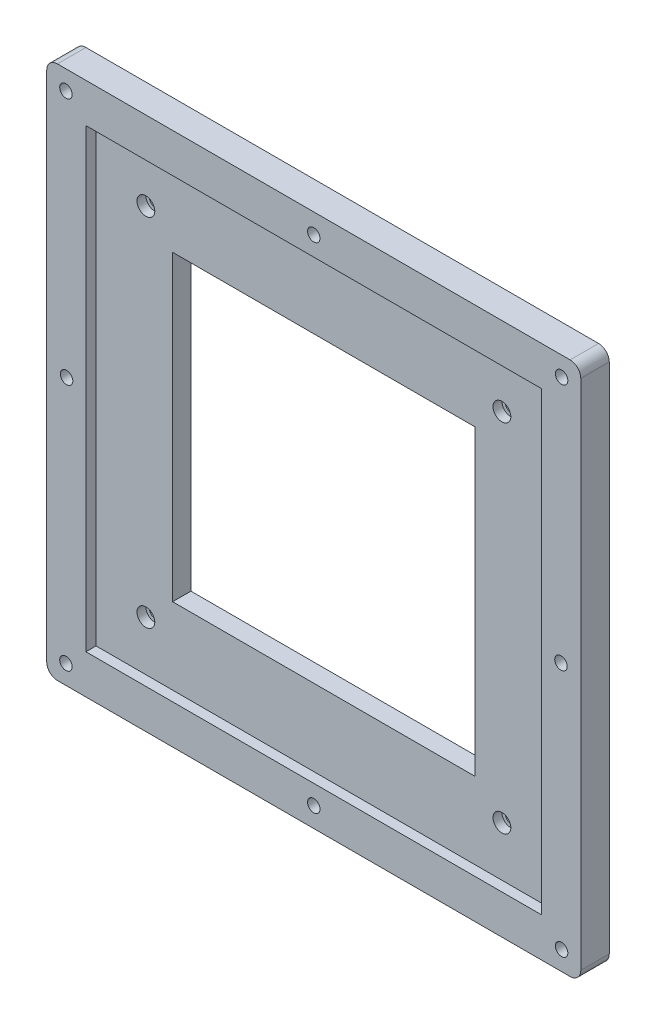
ISO-10303-21;
HEADER;
FILE_DESCRIPTION(('STEP AP214'),'2;1');
FILE_NAME('part.step','',(''),(''),'','','');
FILE_SCHEMA(('AUTOMOTIVE_DESIGN { 1 0 10303 214 1 1 1 1 }'));
ENDSEC;
DATA;
#1=APPLICATION_CONTEXT('core data for automotive mechanical design processes');
#2=APPLICATION_PROTOCOL_DEFINITION('international standard','automotive_design',2000,#1);
#3=PRODUCT_CONTEXT('',#1,'mechanical');
#4=PRODUCT('Part','Part','',(#3));
#5=PRODUCT_RELATED_PRODUCT_CATEGORY('part','',(#4));
#6=PRODUCT_DEFINITION_FORMATION('','',#4);
#7=PRODUCT_DEFINITION_CONTEXT('part definition',#1,'design');
#8=PRODUCT_DEFINITION('design','',#6,#7);
#9=PRODUCT_DEFINITION_SHAPE('','',#8);
#10=(LENGTH_UNIT() NAMED_UNIT(*) SI_UNIT(.MILLI.,.METRE.));
#11=(NAMED_UNIT(*) PLANE_ANGLE_UNIT() SI_UNIT($,.RADIAN.));
#12=(NAMED_UNIT(*) SI_UNIT($,.STERADIAN.) SOLID_ANGLE_UNIT());
#13=UNCERTAINTY_MEASURE_WITH_UNIT(LENGTH_MEASURE(1.E-05),#10,'distance_accuracy_value','');
#14=(GEOMETRIC_REPRESENTATION_CONTEXT(3) GLOBAL_UNCERTAINTY_ASSIGNED_CONTEXT((#13)) GLOBAL_UNIT_ASSIGNED_CONTEXT((#10,
#11,#12)) REPRESENTATION_CONTEXT('',''));
#15=CARTESIAN_POINT('',(0.,0.,0.));
#16=DIRECTION('',(0.,0.,1.));
#17=DIRECTION('',(1.,0.,0.));
#18=AXIS2_PLACEMENT_3D('',#15,#16,#17);
#19=CARTESIAN_POINT('',(42.5,42.5,8.));
#20=DIRECTION('',(-1.,0.,0.));
#21=DIRECTION('',(0.,-1.,0.));
#22=AXIS2_PLACEMENT_3D('',#19,#20,#21);
#23=PLANE('',#22);
#24=DIRECTION('',(0.,0.,-1.));
#25=VECTOR('',#24,1.);
#26=CARTESIAN_POINT('',(42.5,-42.5,8.));
#27=LINE('',#26,#25);
#28=CARTESIAN_POINT('',(42.5,-42.5,5.15));
#29=VERTEX_POINT('',#28);
#30=CARTESIAN_POINT('',(42.5,-42.5,0.));
#31=VERTEX_POINT('',#30);
#32=EDGE_CURVE('E233',#29,#31,#27,.T.);
#33=ORIENTED_EDGE('',*,*,#32,.F.);
#34=DIRECTION('',(0.,1.,0.));
#35=VECTOR('',#34,1.);
#36=CARTESIAN_POINT('',(42.5,42.5,5.15));
#37=LINE('',#36,#35);
#38=CARTESIAN_POINT('',(42.5,42.5,5.15));
#39=VERTEX_POINT('',#38);
#40=EDGE_CURVE('E206',#29,#39,#37,.T.);
#41=ORIENTED_EDGE('',*,*,#40,.T.);
#42=DIRECTION('',(0.,0.,-1.));
#43=VECTOR('',#42,1.);
#44=CARTESIAN_POINT('',(42.5,42.5,8.));
#45=LINE('',#44,#43);
#46=CARTESIAN_POINT('',(42.5,42.5,0.));
#47=VERTEX_POINT('',#46);
#48=EDGE_CURVE('E239',#39,#47,#45,.T.);
#49=ORIENTED_EDGE('',*,*,#48,.T.);
#50=DIRECTION('',(0.,1.,0.));
#51=VECTOR('',#50,1.);
#52=CARTESIAN_POINT('',(42.5,42.5,0.));
#53=LINE('',#52,#51);
#54=EDGE_CURVE('E221',#31,#47,#53,.T.);
#55=ORIENTED_EDGE('',*,*,#54,.F.);
#56=EDGE_LOOP('',(#33,#41,#49,#55));
#57=FACE_BOUND('',#56,.T.);
#58=ADVANCED_FACE('F35',(#57),#23,.T.);
#59=CARTESIAN_POINT('',(-42.5,42.5,8.));
#60=DIRECTION('',(0.,-1.,0.));
#61=DIRECTION('',(0.,0.,-1.));
#62=AXIS2_PLACEMENT_3D('',#59,#60,#61);
#63=PLANE('',#62);
#64=ORIENTED_EDGE('',*,*,#48,.F.);
#65=DIRECTION('',(-1.,0.,0.));
#66=VECTOR('',#65,1.);
#67=CARTESIAN_POINT('',(-42.5,42.5,5.15));
#68=LINE('',#67,#66);
#69=CARTESIAN_POINT('',(-42.5,42.5,5.15));
#70=VERTEX_POINT('',#69);
#71=EDGE_CURVE('E203',#39,#70,#68,.T.);
#72=ORIENTED_EDGE('',*,*,#71,.T.);
#73=DIRECTION('',(0.,0.,-1.));
#74=VECTOR('',#73,1.);
#75=CARTESIAN_POINT('',(-42.5,42.5,8.));
#76=LINE('',#75,#74);
#77=CARTESIAN_POINT('',(-42.5,42.5,0.));
#78=VERTEX_POINT('',#77);
#79=EDGE_CURVE('E237',#70,#78,#76,.T.);
#80=ORIENTED_EDGE('',*,*,#79,.T.);
#81=DIRECTION('',(-1.,0.,0.));
#82=VECTOR('',#81,1.);
#83=CARTESIAN_POINT('',(-42.5,42.5,0.));
#84=LINE('',#83,#82);
#85=EDGE_CURVE('E224',#47,#78,#84,.T.);
#86=ORIENTED_EDGE('',*,*,#85,.F.);
#87=EDGE_LOOP('',(#64,#72,#80,#86));
#88=FACE_BOUND('',#87,.T.);
#89=ADVANCED_FACE('F382',(#88),#63,.T.);
#90=CARTESIAN_POINT('',(-42.5,42.5,8.));
#91=DIRECTION('',(1.,0.,0.));
#92=DIRECTION('',(0.,1.,0.));
#93=AXIS2_PLACEMENT_3D('',#90,#91,#92);
#94=PLANE('',#93);
#95=ORIENTED_EDGE('',*,*,#79,.F.);
#96=DIRECTION('',(0.,-1.,0.));
#97=VECTOR('',#96,1.);
#98=CARTESIAN_POINT('',(-42.5,42.5,5.15));
#99=LINE('',#98,#97);
#100=CARTESIAN_POINT('',(-42.5,-42.5,5.15));
#101=VERTEX_POINT('',#100);
#102=EDGE_CURVE('E200',#70,#101,#99,.T.);
#103=ORIENTED_EDGE('',*,*,#102,.T.);
#104=DIRECTION('',(0.,0.,-1.));
#105=VECTOR('',#104,1.);
#106=CARTESIAN_POINT('',(-42.5,-42.5,8.));
#107=LINE('',#106,#105);
#108=CARTESIAN_POINT('',(-42.5,-42.5,0.));
#109=VERTEX_POINT('',#108);
#110=EDGE_CURVE('E235',#101,#109,#107,.T.);
#111=ORIENTED_EDGE('',*,*,#110,.T.);
#112=DIRECTION('',(0.,-1.,0.));
#113=VECTOR('',#112,1.);
#114=CARTESIAN_POINT('',(-42.5,42.5,0.));
#115=LINE('',#114,#113);
#116=EDGE_CURVE('E227',#78,#109,#115,.T.);
#117=ORIENTED_EDGE('',*,*,#116,.F.);
#118=EDGE_LOOP('',(#95,#103,#111,#117));
#119=FACE_BOUND('',#118,.T.);
#120=ADVANCED_FACE('F388',(#119),#94,.T.);
#121=CARTESIAN_POINT('',(-42.5,-42.5,8.));
#122=DIRECTION('',(0.,1.,0.));
#123=DIRECTION('',(-1.,0.,0.));
#124=AXIS2_PLACEMENT_3D('',#121,#122,#123);
#125=PLANE('',#124);
#126=ORIENTED_EDGE('',*,*,#110,.F.);
#127=DIRECTION('',(1.,0.,0.));
#128=VECTOR('',#127,1.);
#129=CARTESIAN_POINT('',(-42.5,-42.5,5.15));
#130=LINE('',#129,#128);
#131=EDGE_CURVE('E194',#101,#29,#130,.T.);
#132=ORIENTED_EDGE('',*,*,#131,.T.);
#133=ORIENTED_EDGE('',*,*,#32,.T.);
#134=DIRECTION('',(1.,0.,0.));
#135=VECTOR('',#134,1.);
#136=CARTESIAN_POINT('',(-42.5,-42.5,0.));
#137=LINE('',#136,#135);
#138=EDGE_CURVE('E230',#109,#31,#137,.T.);
#139=ORIENTED_EDGE('',*,*,#138,.F.);
#140=EDGE_LOOP('',(#126,#132,#133,#139));
#141=FACE_BOUND('',#140,.T.);
#142=ADVANCED_FACE('F481',(#141),#125,.T.);
#143=CARTESIAN_POINT('',(-50.,50.,8.));
#144=DIRECTION('',(0.,0.,-1.));
#145=DIRECTION('',(-1.,0.,0.));
#146=AXIS2_PLACEMENT_3D('',#143,#144,#145);
#147=CYLINDRICAL_SURFACE('',#146,1.5);
#148=CARTESIAN_POINT('',(-50.,50.,2.65));
#149=DIRECTION('',(0.,0.,-1.));
#150=DIRECTION('',(-1.,0.,0.));
#151=AXIS2_PLACEMENT_3D('',#148,#149,#150);
#152=CIRCLE('',#151,1.5);
#153=CARTESIAN_POINT('',(-51.5,50.,2.65));
#154=VERTEX_POINT('',#153);
#155=EDGE_CURVE('E188',#154,#154,#152,.T.);
#156=ORIENTED_EDGE('',*,*,#155,.F.);
#157=EDGE_LOOP('',(#156));
#158=FACE_BOUND('',#157,.T.);
#159=CARTESIAN_POINT('',(-50.,50.,0.));
#160=DIRECTION('',(0.,0.,1.));
#161=DIRECTION('',(1.,0.,0.));
#162=AXIS2_PLACEMENT_3D('',#159,#160,#161);
#163=CIRCLE('',#162,1.5);
#164=CARTESIAN_POINT('',(-48.5,50.,0.));
#165=VERTEX_POINT('',#164);
#166=EDGE_CURVE('E218',#165,#165,#163,.T.);
#167=ORIENTED_EDGE('',*,*,#166,.F.);
#168=EDGE_LOOP('',(#167));
#169=FACE_BOUND('',#168,.T.);
#170=ADVANCED_FACE('F477',(#158,#169),#147,.F.);
#171=CARTESIAN_POINT('',(50.,50.0000000000042,8.));
#172=DIRECTION('',(0.,0.,-1.));
#173=DIRECTION('',(-1.,0.,0.));
#174=AXIS2_PLACEMENT_3D('',#171,#172,#173);
#175=CYLINDRICAL_SURFACE('',#174,1.5);
#176=CARTESIAN_POINT('',(50.,50.0000000000042,2.65));
#177=DIRECTION('',(0.,0.,-1.));
#178=DIRECTION('',(-1.,0.,0.));
#179=AXIS2_PLACEMENT_3D('',#176,#177,#178);
#180=CIRCLE('',#179,1.5);
#181=CARTESIAN_POINT('',(48.5,50.0000000000042,2.65));
#182=VERTEX_POINT('',#181);
#183=EDGE_CURVE('E300',#182,#182,#180,.T.);
#184=ORIENTED_EDGE('',*,*,#183,.F.);
#185=EDGE_LOOP('',(#184));
#186=FACE_BOUND('',#185,.T.);
#187=CARTESIAN_POINT('',(50.,50.0000000000042,0.));
#188=DIRECTION('',(0.,0.,1.));
#189=DIRECTION('',(1.,0.,0.));
#190=AXIS2_PLACEMENT_3D('',#187,#188,#189);
#191=CIRCLE('',#190,1.5);
#192=CARTESIAN_POINT('',(51.5,50.0000000000042,0.));
#193=VERTEX_POINT('',#192);
#194=EDGE_CURVE('E215',#193,#193,#191,.T.);
#195=ORIENTED_EDGE('',*,*,#194,.F.);
#196=EDGE_LOOP('',(#195));
#197=FACE_BOUND('',#196,.T.);
#198=ADVANCED_FACE('F468',(#186,#197),#175,.F.);
#199=CARTESIAN_POINT('',(50.0000000000042,-49.9999999999958,8.));
#200=DIRECTION('',(0.,0.,-1.));
#201=DIRECTION('',(-1.,0.,0.));
#202=AXIS2_PLACEMENT_3D('',#199,#200,#201);
#203=CYLINDRICAL_SURFACE('',#202,1.5);
#204=CARTESIAN_POINT('',(50.0000000000042,-49.9999999999958,2.65));
#205=DIRECTION('',(0.,0.,-1.));
#206=DIRECTION('',(-1.,0.,0.));
#207=AXIS2_PLACEMENT_3D('',#204,#205,#206);
#208=CIRCLE('',#207,1.5);
#209=CARTESIAN_POINT('',(48.5000000000042,-49.9999999999958,2.65));
#210=VERTEX_POINT('',#209);
#211=EDGE_CURVE('E296',#210,#210,#208,.T.);
#212=ORIENTED_EDGE('',*,*,#211,.F.);
#213=EDGE_LOOP('',(#212));
#214=FACE_BOUND('',#213,.T.);
#215=CARTESIAN_POINT('',(50.0000000000042,-49.9999999999958,0.));
#216=DIRECTION('',(0.,0.,1.));
#217=DIRECTION('',(1.,0.,0.));
#218=AXIS2_PLACEMENT_3D('',#215,#216,#217);
#219=CIRCLE('',#218,1.5);
#220=CARTESIAN_POINT('',(51.5000000000042,-49.9999999999958,0.));
#221=VERTEX_POINT('',#220);
#222=EDGE_CURVE('E212',#221,#221,#219,.T.);
#223=ORIENTED_EDGE('',*,*,#222,.F.);
#224=EDGE_LOOP('',(#223));
#225=FACE_BOUND('',#224,.T.);
#226=ADVANCED_FACE('F462',(#214,#225),#203,.F.);
#227=CARTESIAN_POINT('',(-49.9999999999958,-50.,8.));
#228=DIRECTION('',(0.,0.,-1.));
#229=DIRECTION('',(-1.,0.,0.));
#230=AXIS2_PLACEMENT_3D('',#227,#228,#229);
#231=CYLINDRICAL_SURFACE('',#230,1.5);
#232=CARTESIAN_POINT('',(-49.9999999999958,-50.,2.65));
#233=DIRECTION('',(0.,0.,-1.));
#234=DIRECTION('',(-1.,0.,0.));
#235=AXIS2_PLACEMENT_3D('',#232,#233,#234);
#236=CIRCLE('',#235,1.5);
#237=CARTESIAN_POINT('',(-51.4999999999958,-50.,2.65));
#238=VERTEX_POINT('',#237);
#239=EDGE_CURVE('E293',#238,#238,#236,.T.);
#240=ORIENTED_EDGE('',*,*,#239,.F.);
#241=EDGE_LOOP('',(#240));
#242=FACE_BOUND('',#241,.T.);
#243=CARTESIAN_POINT('',(-49.9999999999958,-50.,0.));
#244=DIRECTION('',(0.,0.,1.));
#245=DIRECTION('',(1.,0.,0.));
#246=AXIS2_PLACEMENT_3D('',#243,#244,#245);
#247=CIRCLE('',#246,1.5);
#248=CARTESIAN_POINT('',(-48.4999999999958,-50.,0.));
#249=VERTEX_POINT('',#248);
#250=EDGE_CURVE('E209',#249,#249,#247,.T.);
#251=ORIENTED_EDGE('',*,*,#250,.F.);
#252=EDGE_LOOP('',(#251));
#253=FACE_BOUND('',#252,.T.);
#254=ADVANCED_FACE('F398',(#242,#253),#231,.F.);
#255=CARTESIAN_POINT('',(0.,0.,8.));
#256=DIRECTION('',(0.,0.,1.));
#257=DIRECTION('',(1.,0.,0.));
#258=AXIS2_PLACEMENT_3D('',#255,#256,#257);
#259=PLANE('',#258);
#260=CARTESIAN_POINT('',(7.87642173307148E-12,-69.4313225757113,8.));
#261=DIRECTION('',(0.,0.,1.));
#262=DIRECTION('',(1.,0.,0.));
#263=AXIS2_PLACEMENT_3D('',#260,#261,#262);
#264=CIRCLE('',#263,1.750000000008);
#265=CARTESIAN_POINT('',(1.75000000001587,-69.4313225757113,8.));
#266=VERTEX_POINT('',#265);
#267=EDGE_CURVE('E753',#266,#266,#264,.T.);
#268=ORIENTED_EDGE('',*,*,#267,.F.);
#269=EDGE_LOOP('',(#268));
#270=FACE_BOUND('',#269,.T.);
#271=CARTESIAN_POINT('',(69.6101910608104,69.6101910608104,8.));
#272=DIRECTION('',(0.,0.,1.));
#273=DIRECTION('',(1.,0.,0.));
#274=AXIS2_PLACEMENT_3D('',#271,#272,#273);
#275=CIRCLE('',#274,1.75000000000246);
#276=CARTESIAN_POINT('',(71.3601910608128,69.6101910608104,8.));
#277=VERTEX_POINT('',#276);
#278=EDGE_CURVE('E754',#277,#277,#275,.T.);
#279=ORIENTED_EDGE('',*,*,#278,.F.);
#280=EDGE_LOOP('',(#279));
#281=FACE_BOUND('',#280,.T.);
#282=CARTESIAN_POINT('',(69.4313225757152,3.93821086653574E-12,8.));
#283=DIRECTION('',(0.,0.,1.));
#284=DIRECTION('',(1.,0.,0.));
#285=AXIS2_PLACEMENT_3D('',#282,#283,#284);
#286=CIRCLE('',#285,1.75000000000285);
#287=CARTESIAN_POINT('',(71.1813225757181,3.93821086653574E-12,8.));
#288=VERTEX_POINT('',#287);
#289=EDGE_CURVE('E758',#288,#288,#286,.T.);
#290=ORIENTED_EDGE('',*,*,#289,.F.);
#291=EDGE_LOOP('',(#290));
#292=FACE_BOUND('',#291,.T.);
#293=CARTESIAN_POINT('',(-69.6101910608068,69.6101910608061,8.));
#294=DIRECTION('',(0.,0.,1.));
#295=DIRECTION('',(1.,0.,0.));
#296=AXIS2_PLACEMENT_3D('',#293,#294,#295);
#297=CIRCLE('',#296,1.75);
#298=CARTESIAN_POINT('',(-67.8601910608068,69.6101910608061,8.));
#299=VERTEX_POINT('',#298);
#300=EDGE_CURVE('E765',#299,#299,#297,.T.);
#301=ORIENTED_EDGE('',*,*,#300,.F.);
#302=EDGE_LOOP('',(#301));
#303=FACE_BOUND('',#302,.T.);
#304=CARTESIAN_POINT('',(-69.6101910608025,-69.6101910608104,8.));
#305=DIRECTION('',(0.,0.,1.));
#306=DIRECTION('',(1.,0.,0.));
#307=AXIS2_PLACEMENT_3D('',#304,#305,#306);
#308=CIRCLE('',#307,1.75000000000537);
#309=CARTESIAN_POINT('',(-67.8601910607971,-69.6101910608104,8.));
#310=VERTEX_POINT('',#309);
#311=EDGE_CURVE('E777',#310,#310,#308,.T.);
#312=ORIENTED_EDGE('',*,*,#311,.F.);
#313=EDGE_LOOP('',(#312));
#314=FACE_BOUND('',#313,.T.);
#315=CARTESIAN_POINT('',(-69.4313225757073,-3.94671375123103E-12,8.));
#316=DIRECTION('',(0.,0.,1.));
#317=DIRECTION('',(1.,0.,0.));
#318=AXIS2_PLACEMENT_3D('',#315,#316,#317);
#319=CIRCLE('',#318,1.75000000000562);
#320=CARTESIAN_POINT('',(-67.6813225757017,-3.94671375123103E-12,8.));
#321=VERTEX_POINT('',#320);
#322=EDGE_CURVE('E761',#321,#321,#319,.T.);
#323=ORIENTED_EDGE('',*,*,#322,.F.);
#324=EDGE_LOOP('',(#323));
#325=FACE_BOUND('',#324,.T.);
#326=CARTESIAN_POINT('',(69.6101910608143,-69.6101910608064,8.));
#327=DIRECTION('',(0.,0.,1.));
#328=DIRECTION('',(1.,0.,0.));
#329=AXIS2_PLACEMENT_3D('',#326,#327,#328);
#330=CIRCLE('',#329,1.75000000000769);
#331=CARTESIAN_POINT('',(71.360191060822,-69.6101910608064,8.));
#332=VERTEX_POINT('',#331);
#333=EDGE_CURVE('E755',#332,#332,#330,.T.);
#334=ORIENTED_EDGE('',*,*,#333,.F.);
#335=EDGE_LOOP('',(#334));
#336=FACE_BOUND('',#335,.T.);
#337=CARTESIAN_POINT('',(0.,69.4313225757113,8.));
#338=DIRECTION('',(0.,0.,1.));
#339=DIRECTION('',(1.,0.,0.));
#340=AXIS2_PLACEMENT_3D('',#337,#338,#339);
#341=CIRCLE('',#340,1.75);
#342=CARTESIAN_POINT('',(1.75,69.4313225757113,8.));
#343=VERTEX_POINT('',#342);
#344=EDGE_CURVE('E309',#343,#343,#341,.T.);
#345=ORIENTED_EDGE('',*,*,#344,.F.);
#346=EDGE_LOOP('',(#345));
#347=FACE_BOUND('',#346,.T.);
#348=DIRECTION('',(0.,1.,0.));
#349=VECTOR('',#348,1.);
#350=CARTESIAN_POINT('',(64.,64.,8.));
#351=LINE('',#350,#349);
#352=CARTESIAN_POINT('',(64.,-64.,8.));
#353=VERTEX_POINT('',#352);
#354=CARTESIAN_POINT('',(64.,64.,8.));
#355=VERTEX_POINT('',#354);
#356=EDGE_CURVE('E158',#353,#355,#351,.T.);
#357=ORIENTED_EDGE('',*,*,#356,.F.);
#358=DIRECTION('',(1.,0.,0.));
#359=VECTOR('',#358,1.);
#360=CARTESIAN_POINT('',(-64.,-64.,8.));
#361=LINE('',#360,#359);
#362=CARTESIAN_POINT('',(-64.,-64.,8.));
#363=VERTEX_POINT('',#362);
#364=EDGE_CURVE('E175',#363,#353,#361,.T.);
#365=ORIENTED_EDGE('',*,*,#364,.F.);
#366=DIRECTION('',(0.,-1.,0.));
#367=VECTOR('',#366,1.);
#368=CARTESIAN_POINT('',(-64.,64.,8.));
#369=LINE('',#368,#367);
#370=CARTESIAN_POINT('',(-64.,64.,8.));
#371=VERTEX_POINT('',#370);
#372=EDGE_CURVE('E178',#371,#363,#369,.T.);
#373=ORIENTED_EDGE('',*,*,#372,.F.);
#374=DIRECTION('',(-1.,0.,0.));
#375=VECTOR('',#374,1.);
#376=CARTESIAN_POINT('',(-64.,64.,8.));
#377=LINE('',#376,#375);
#378=EDGE_CURVE('E187',#355,#371,#377,.T.);
#379=ORIENTED_EDGE('',*,*,#378,.F.);
#380=EDGE_LOOP('',(#357,#365,#373,#379));
#381=FACE_BOUND('',#380,.T.);
#382=DIRECTION('',(0.,-1.,0.));
#383=VECTOR('',#382,1.);
#384=CARTESIAN_POINT('',(-75.,74.9999999999998,8.));
#385=LINE('',#384,#383);
#386=CARTESIAN_POINT('',(-75.,71.9999999999998,8.));
#387=VERTEX_POINT('',#386);
#388=CARTESIAN_POINT('',(-75.,-71.9999999999997,8.));
#389=VERTEX_POINT('',#388);
#390=EDGE_CURVE('E247',#387,#389,#385,.T.);
#391=ORIENTED_EDGE('',*,*,#390,.T.);
#392=CARTESIAN_POINT('',(-72.,-71.9999999999997,8.));
#393=DIRECTION('',(0.,0.,1.));
#394=DIRECTION('',(1.,0.,0.));
#395=AXIS2_PLACEMENT_3D('',#392,#393,#394);
#396=CIRCLE('',#395,3.);
#397=CARTESIAN_POINT('',(-72.,-74.9999999999997,8.));
#398=VERTEX_POINT('',#397);
#399=EDGE_CURVE('E285',#389,#398,#396,.T.);
#400=ORIENTED_EDGE('',*,*,#399,.T.);
#401=DIRECTION('',(1.,0.,0.));
#402=VECTOR('',#401,1.);
#403=CARTESIAN_POINT('',(-75.,-74.9999999999997,8.));
#404=LINE('',#403,#402);
#405=CARTESIAN_POINT('',(72.,-74.9999999999997,8.));
#406=VERTEX_POINT('',#405);
#407=EDGE_CURVE('E250',#398,#406,#404,.T.);
#408=ORIENTED_EDGE('',*,*,#407,.T.);
#409=CARTESIAN_POINT('',(72.,-71.9999999999997,8.));
#410=DIRECTION('',(0.,0.,1.));
#411=DIRECTION('',(1.,0.,0.));
#412=AXIS2_PLACEMENT_3D('',#409,#410,#411);
#413=CIRCLE('',#412,3.);
#414=CARTESIAN_POINT('',(75.,-71.9999999999997,8.));
#415=VERTEX_POINT('',#414);
#416=EDGE_CURVE('E283',#406,#415,#413,.T.);
#417=ORIENTED_EDGE('',*,*,#416,.T.);
#418=DIRECTION('',(0.,1.,0.));
#419=VECTOR('',#418,1.);
#420=CARTESIAN_POINT('',(75.,74.9999999999998,8.));
#421=LINE('',#420,#419);
#422=CARTESIAN_POINT('',(75.,71.9999999999998,8.));
#423=VERTEX_POINT('',#422);
#424=EDGE_CURVE('E242',#415,#423,#421,.T.);
#425=ORIENTED_EDGE('',*,*,#424,.T.);
#426=CARTESIAN_POINT('',(72.,71.9999999999998,8.));
#427=DIRECTION('',(0.,0.,1.));
#428=DIRECTION('',(1.,0.,0.));
#429=AXIS2_PLACEMENT_3D('',#426,#427,#428);
#430=CIRCLE('',#429,3.);
#431=CARTESIAN_POINT('',(72.,74.9999999999998,8.));
#432=VERTEX_POINT('',#431);
#433=EDGE_CURVE('E58',#423,#432,#430,.T.);
#434=ORIENTED_EDGE('',*,*,#433,.T.);
#435=DIRECTION('',(-1.,0.,0.));
#436=VECTOR('',#435,1.);
#437=CARTESIAN_POINT('',(-75.,74.9999999999998,8.));
#438=LINE('',#437,#436);
#439=CARTESIAN_POINT('',(-72.,74.9999999999998,8.));
#440=VERTEX_POINT('',#439);
#441=EDGE_CURVE('E244',#432,#440,#438,.T.);
#442=ORIENTED_EDGE('',*,*,#441,.T.);
#443=CARTESIAN_POINT('',(-72.,71.9999999999998,8.));
#444=DIRECTION('',(0.,0.,1.));
#445=DIRECTION('',(1.,0.,0.));
#446=AXIS2_PLACEMENT_3D('',#443,#444,#445);
#447=CIRCLE('',#446,3.);
#448=EDGE_CURVE('E280',#440,#387,#447,.T.);
#449=ORIENTED_EDGE('',*,*,#448,.T.);
#450=EDGE_LOOP('',(#391,#400,#408,#417,#425,#434,#442,#449));
#451=FACE_BOUND('',#450,.T.);
#452=ADVANCED_FACE('F394',(#270,#281,#292,#303,#314,#325,#336,#347,#381,#451),#259,.T.);
#453=CARTESIAN_POINT('',(0.,0.,0.));
#454=DIRECTION('',(0.,0.,1.));
#455=DIRECTION('',(1.,0.,0.));
#456=AXIS2_PLACEMENT_3D('',#453,#454,#455);
#457=PLANE('',#456);
#458=CARTESIAN_POINT('',(7.87642173307148E-12,-69.4313225757113,0.));
#459=DIRECTION('',(0.,0.,1.));
#460=DIRECTION('',(1.,0.,0.));
#461=AXIS2_PLACEMENT_3D('',#458,#459,#460);
#462=CIRCLE('',#461,1.750000000008);
#463=CARTESIAN_POINT('',(1.75000000001587,-69.4313225757113,0.));
#464=VERTEX_POINT('',#463);
#465=EDGE_CURVE('E39',#464,#464,#462,.T.);
#466=ORIENTED_EDGE('',*,*,#465,.T.);
#467=EDGE_LOOP('',(#466));
#468=FACE_BOUND('',#467,.T.);
#469=CARTESIAN_POINT('',(69.6101910608104,69.6101910608104,0.));
#470=DIRECTION('',(0.,0.,1.));
#471=DIRECTION('',(1.,0.,0.));
#472=AXIS2_PLACEMENT_3D('',#469,#470,#471);
#473=CIRCLE('',#472,1.75000000000246);
#474=CARTESIAN_POINT('',(71.3601910608128,69.6101910608104,0.));
#475=VERTEX_POINT('',#474);
#476=EDGE_CURVE('E323',#475,#475,#473,.T.);
#477=ORIENTED_EDGE('',*,*,#476,.T.);
#478=EDGE_LOOP('',(#477));
#479=FACE_BOUND('',#478,.T.);
#480=CARTESIAN_POINT('',(69.4313225757152,3.93821086653574E-12,0.));
#481=DIRECTION('',(0.,0.,1.));
#482=DIRECTION('',(1.,0.,0.));
#483=AXIS2_PLACEMENT_3D('',#480,#481,#482);
#484=CIRCLE('',#483,1.75000000000285);
#485=CARTESIAN_POINT('',(71.1813225757181,3.93821086653574E-12,0.));
#486=VERTEX_POINT('',#485);
#487=EDGE_CURVE('E321',#486,#486,#484,.T.);
#488=ORIENTED_EDGE('',*,*,#487,.T.);
#489=EDGE_LOOP('',(#488));
#490=FACE_BOUND('',#489,.T.);
#491=CARTESIAN_POINT('',(-69.6101910608068,69.6101910608061,0.));
#492=DIRECTION('',(0.,0.,1.));
#493=DIRECTION('',(1.,0.,0.));
#494=AXIS2_PLACEMENT_3D('',#491,#492,#493);
#495=CIRCLE('',#494,1.75);
#496=CARTESIAN_POINT('',(-67.8601910608068,69.6101910608061,0.));
#497=VERTEX_POINT('',#496);
#498=EDGE_CURVE('E318',#497,#497,#495,.T.);
#499=ORIENTED_EDGE('',*,*,#498,.T.);
#500=EDGE_LOOP('',(#499));
#501=FACE_BOUND('',#500,.T.);
#502=CARTESIAN_POINT('',(-69.6101910608025,-69.6101910608104,0.));
#503=DIRECTION('',(0.,0.,1.));
#504=DIRECTION('',(1.,0.,0.));
#505=AXIS2_PLACEMENT_3D('',#502,#503,#504);
#506=CIRCLE('',#505,1.75000000000537);
#507=CARTESIAN_POINT('',(-67.8601910607971,-69.6101910608104,0.));
#508=VERTEX_POINT('',#507);
#509=EDGE_CURVE('E315',#508,#508,#506,.T.);
#510=ORIENTED_EDGE('',*,*,#509,.T.);
#511=EDGE_LOOP('',(#510));
#512=FACE_BOUND('',#511,.T.);
#513=CARTESIAN_POINT('',(-69.4313225757073,-3.94671375123103E-12,0.));
#514=DIRECTION('',(0.,0.,1.));
#515=DIRECTION('',(1.,0.,0.));
#516=AXIS2_PLACEMENT_3D('',#513,#514,#515);
#517=CIRCLE('',#516,1.75000000000562);
#518=CARTESIAN_POINT('',(-67.6813225757017,-3.94671375123103E-12,0.));
#519=VERTEX_POINT('',#518);
#520=EDGE_CURVE('E312',#519,#519,#517,.T.);
#521=ORIENTED_EDGE('',*,*,#520,.T.);
#522=EDGE_LOOP('',(#521));
#523=FACE_BOUND('',#522,.T.);
#524=CARTESIAN_POINT('',(69.6101910608143,-69.6101910608064,0.));
#525=DIRECTION('',(0.,0.,1.));
#526=DIRECTION('',(1.,0.,0.));
#527=AXIS2_PLACEMENT_3D('',#524,#525,#526);
#528=CIRCLE('',#527,1.75000000000769);
#529=CARTESIAN_POINT('',(71.360191060822,-69.6101910608064,0.));
#530=VERTEX_POINT('',#529);
#531=EDGE_CURVE('E308',#530,#530,#528,.T.);
#532=ORIENTED_EDGE('',*,*,#531,.T.);
#533=EDGE_LOOP('',(#532));
#534=FACE_BOUND('',#533,.T.);
#535=CARTESIAN_POINT('',(0.,69.4313225757113,0.));
#536=DIRECTION('',(0.,0.,1.));
#537=DIRECTION('',(1.,0.,0.));
#538=AXIS2_PLACEMENT_3D('',#535,#536,#537);
#539=CIRCLE('',#538,1.75);
#540=CARTESIAN_POINT('',(1.75,69.4313225757113,0.));
#541=VERTEX_POINT('',#540);
#542=EDGE_CURVE('E305',#541,#541,#539,.T.);
#543=ORIENTED_EDGE('',*,*,#542,.T.);
#544=EDGE_LOOP('',(#543));
#545=FACE_BOUND('',#544,.T.);
#546=DIRECTION('',(1.,0.,0.));
#547=VECTOR('',#546,1.);
#548=CARTESIAN_POINT('',(-75.,-74.9999999999997,0.));
#549=LINE('',#548,#547);
#550=CARTESIAN_POINT('',(-72.,-74.9999999999997,0.));
#551=VERTEX_POINT('',#550);
#552=CARTESIAN_POINT('',(72.,-74.9999999999997,0.));
#553=VERTEX_POINT('',#552);
#554=EDGE_CURVE('E245',#551,#553,#549,.T.);
#555=ORIENTED_EDGE('',*,*,#554,.F.);
#556=CARTESIAN_POINT('',(-72.,-71.9999999999997,0.));
#557=DIRECTION('',(0.,0.,1.));
#558=DIRECTION('',(1.,0.,0.));
#559=AXIS2_PLACEMENT_3D('',#556,#557,#558);
#560=CIRCLE('',#559,3.);
#561=CARTESIAN_POINT('',(-75.,-71.9999999999997,0.));
#562=VERTEX_POINT('',#561);
#563=EDGE_CURVE('E273',#551,#562,#560,.F.);
#564=ORIENTED_EDGE('',*,*,#563,.T.);
#565=DIRECTION('',(0.,-1.,0.));
#566=VECTOR('',#565,1.);
#567=CARTESIAN_POINT('',(-75.,74.9999999999998,0.));
#568=LINE('',#567,#566);
#569=CARTESIAN_POINT('',(-75.,71.9999999999998,0.));
#570=VERTEX_POINT('',#569);
#571=EDGE_CURVE('E258',#570,#562,#568,.T.);
#572=ORIENTED_EDGE('',*,*,#571,.F.);
#573=CARTESIAN_POINT('',(-72.,71.9999999999998,0.));
#574=DIRECTION('',(0.,0.,1.));
#575=DIRECTION('',(1.,0.,0.));
#576=AXIS2_PLACEMENT_3D('',#573,#574,#575);
#577=CIRCLE('',#576,3.);
#578=CARTESIAN_POINT('',(-72.,74.9999999999998,0.));
#579=VERTEX_POINT('',#578);
#580=EDGE_CURVE('E267',#570,#579,#577,.F.);
#581=ORIENTED_EDGE('',*,*,#580,.T.);
#582=DIRECTION('',(-1.,0.,0.));
#583=VECTOR('',#582,1.);
#584=CARTESIAN_POINT('',(-75.,74.9999999999998,0.));
#585=LINE('',#584,#583);
#586=CARTESIAN_POINT('',(72.,74.9999999999998,0.));
#587=VERTEX_POINT('',#586);
#588=EDGE_CURVE('E256',#587,#579,#585,.T.);
#589=ORIENTED_EDGE('',*,*,#588,.F.);
#590=CARTESIAN_POINT('',(72.,71.9999999999998,0.));
#591=DIRECTION('',(0.,0.,1.));
#592=DIRECTION('',(1.,0.,0.));
#593=AXIS2_PLACEMENT_3D('',#590,#591,#592);
#594=CIRCLE('',#593,3.);
#595=CARTESIAN_POINT('',(75.,71.9999999999998,0.));
#596=VERTEX_POINT('',#595);
#597=EDGE_CURVE('E269',#587,#596,#594,.F.);
#598=ORIENTED_EDGE('',*,*,#597,.T.);
#599=DIRECTION('',(0.,1.,0.));
#600=VECTOR('',#599,1.);
#601=CARTESIAN_POINT('',(75.,74.9999999999998,0.));
#602=LINE('',#601,#600);
#603=CARTESIAN_POINT('',(75.,-71.9999999999997,0.));
#604=VERTEX_POINT('',#603);
#605=EDGE_CURVE('E241',#604,#596,#602,.T.);
#606=ORIENTED_EDGE('',*,*,#605,.F.);
#607=CARTESIAN_POINT('',(72.,-71.9999999999997,0.));
#608=DIRECTION('',(0.,0.,1.));
#609=DIRECTION('',(1.,0.,0.));
#610=AXIS2_PLACEMENT_3D('',#607,#608,#609);
#611=CIRCLE('',#610,3.);
#612=EDGE_CURVE('E271',#604,#553,#611,.F.);
#613=ORIENTED_EDGE('',*,*,#612,.T.);
#614=EDGE_LOOP('',(#555,#564,#572,#581,#589,#598,#606,#613));
#615=FACE_BOUND('',#614,.T.);
#616=ORIENTED_EDGE('',*,*,#54,.T.);
#617=ORIENTED_EDGE('',*,*,#85,.T.);
#618=ORIENTED_EDGE('',*,*,#116,.T.);
#619=ORIENTED_EDGE('',*,*,#138,.T.);
#620=EDGE_LOOP('',(#616,#617,#618,#619));
#621=FACE_BOUND('',#620,.T.);
#622=ORIENTED_EDGE('',*,*,#166,.T.);
#623=EDGE_LOOP('',(#622));
#624=FACE_BOUND('',#623,.T.);
#625=ORIENTED_EDGE('',*,*,#194,.T.);
#626=EDGE_LOOP('',(#625));
#627=FACE_BOUND('',#626,.T.);
#628=ORIENTED_EDGE('',*,*,#222,.T.);
#629=EDGE_LOOP('',(#628));
#630=FACE_BOUND('',#629,.T.);
#631=ORIENTED_EDGE('',*,*,#250,.T.);
#632=EDGE_LOOP('',(#631));
#633=FACE_BOUND('',#632,.T.);
#634=ADVANCED_FACE('F397',(#468,#479,#490,#501,#512,#523,#534,#545,#615,#621,#624,#627,#630,
#633),#457,.F.);
#635=CARTESIAN_POINT('',(75.,74.9999999999998,8.));
#636=DIRECTION('',(-1.,0.,0.));
#637=DIRECTION('',(0.,-1.,0.));
#638=AXIS2_PLACEMENT_3D('',#635,#636,#637);
#639=PLANE('',#638);
#640=ORIENTED_EDGE('',*,*,#424,.F.);
#641=DIRECTION('',(0.,0.,-1.));
#642=VECTOR('',#641,1.);
#643=CARTESIAN_POINT('',(75.,-71.9999999999997,8.));
#644=LINE('',#643,#642);
#645=EDGE_CURVE('E289',#415,#604,#644,.T.);
#646=ORIENTED_EDGE('',*,*,#645,.T.);
#647=ORIENTED_EDGE('',*,*,#605,.T.);
#648=DIRECTION('',(0.,0.,-1.));
#649=VECTOR('',#648,1.);
#650=CARTESIAN_POINT('',(75.,71.9999999999998,8.));
#651=LINE('',#650,#649);
#652=EDGE_CURVE('E287',#596,#423,#651,.F.);
#653=ORIENTED_EDGE('',*,*,#652,.T.);
#654=EDGE_LOOP('',(#640,#646,#647,#653));
#655=FACE_BOUND('',#654,.T.);
#656=ADVANCED_FACE('F402',(#655),#639,.F.);
#657=CARTESIAN_POINT('',(-75.,74.9999999999998,8.));
#658=DIRECTION('',(0.,-1.,0.));
#659=DIRECTION('',(0.,0.,-1.));
#660=AXIS2_PLACEMENT_3D('',#657,#658,#659);
#661=PLANE('',#660);
#662=ORIENTED_EDGE('',*,*,#441,.F.);
#663=DIRECTION('',(0.,0.,-1.));
#664=VECTOR('',#663,1.);
#665=CARTESIAN_POINT('',(72.,74.9999999999998,8.));
#666=LINE('',#665,#664);
#667=EDGE_CURVE('E11',#432,#587,#666,.T.);
#668=ORIENTED_EDGE('',*,*,#667,.T.);
#669=ORIENTED_EDGE('',*,*,#588,.T.);
#670=DIRECTION('',(0.,0.,-1.));
#671=VECTOR('',#670,1.);
#672=CARTESIAN_POINT('',(-72.,74.9999999999998,8.));
#673=LINE('',#672,#671);
#674=EDGE_CURVE('E44',#579,#440,#673,.F.);
#675=ORIENTED_EDGE('',*,*,#674,.T.);
#676=EDGE_LOOP('',(#662,#668,#669,#675));
#677=FACE_BOUND('',#676,.T.);
#678=ADVANCED_FACE('F410',(#677),#661,.F.);
#679=CARTESIAN_POINT('',(-75.,74.9999999999998,8.));
#680=DIRECTION('',(1.,0.,0.));
#681=DIRECTION('',(0.,0.,-1.));
#682=AXIS2_PLACEMENT_3D('',#679,#680,#681);
#683=PLANE('',#682);
#684=ORIENTED_EDGE('',*,*,#571,.T.);
#685=DIRECTION('',(0.,0.,-1.));
#686=VECTOR('',#685,1.);
#687=CARTESIAN_POINT('',(-75.,-71.9999999999997,8.));
#688=LINE('',#687,#686);
#689=EDGE_CURVE('E278',#562,#389,#688,.F.);
#690=ORIENTED_EDGE('',*,*,#689,.T.);
#691=ORIENTED_EDGE('',*,*,#390,.F.);
#692=DIRECTION('',(0.,0.,-1.));
#693=VECTOR('',#692,1.);
#694=CARTESIAN_POINT('',(-75.,71.9999999999998,8.));
#695=LINE('',#694,#693);
#696=EDGE_CURVE('E275',#387,#570,#695,.T.);
#697=ORIENTED_EDGE('',*,*,#696,.T.);
#698=EDGE_LOOP('',(#684,#690,#691,#697));
#699=FACE_BOUND('',#698,.T.);
#700=ADVANCED_FACE('F406',(#699),#683,.F.);
#701=CARTESIAN_POINT('',(-75.,-74.9999999999997,8.));
#702=DIRECTION('',(0.,1.,0.));
#703=DIRECTION('',(0.,0.,1.));
#704=AXIS2_PLACEMENT_3D('',#701,#702,#703);
#705=PLANE('',#704);
#706=ORIENTED_EDGE('',*,*,#407,.F.);
#707=DIRECTION('',(0.,0.,-1.));
#708=VECTOR('',#707,1.);
#709=CARTESIAN_POINT('',(-72.,-74.9999999999997,8.));
#710=LINE('',#709,#708);
#711=EDGE_CURVE('E264',#398,#551,#710,.T.);
#712=ORIENTED_EDGE('',*,*,#711,.T.);
#713=ORIENTED_EDGE('',*,*,#554,.T.);
#714=DIRECTION('',(0.,0.,-1.));
#715=VECTOR('',#714,1.);
#716=CARTESIAN_POINT('',(72.,-74.9999999999997,8.));
#717=LINE('',#716,#715);
#718=EDGE_CURVE('E253',#553,#406,#717,.F.);
#719=ORIENTED_EDGE('',*,*,#718,.T.);
#720=EDGE_LOOP('',(#706,#712,#713,#719));
#721=FACE_BOUND('',#720,.T.);
#722=ADVANCED_FACE('F403',(#721),#705,.F.);
#723=CARTESIAN_POINT('',(64.,64.,5.15));
#724=DIRECTION('',(1.,0.,0.));
#725=DIRECTION('',(0.,1.,0.));
#726=AXIS2_PLACEMENT_3D('',#723,#724,#725);
#727=PLANE('',#726);
#728=ORIENTED_EDGE('',*,*,#356,.T.);
#729=DIRECTION('',(0.,0.,1.));
#730=VECTOR('',#729,1.);
#731=CARTESIAN_POINT('',(64.,64.,5.15));
#732=LINE('',#731,#730);
#733=CARTESIAN_POINT('',(64.,64.,5.15));
#734=VERTEX_POINT('',#733);
#735=EDGE_CURVE('E151',#734,#355,#732,.T.);
#736=ORIENTED_EDGE('',*,*,#735,.F.);
#737=DIRECTION('',(0.,1.,0.));
#738=VECTOR('',#737,1.);
#739=CARTESIAN_POINT('',(64.,64.,5.15));
#740=LINE('',#739,#738);
#741=CARTESIAN_POINT('',(64.,-64.,5.15));
#742=VERTEX_POINT('',#741);
#743=EDGE_CURVE('E155',#742,#734,#740,.T.);
#744=ORIENTED_EDGE('',*,*,#743,.F.);
#745=DIRECTION('',(0.,0.,1.));
#746=VECTOR('',#745,1.);
#747=CARTESIAN_POINT('',(64.,-64.,5.15));
#748=LINE('',#747,#746);
#749=EDGE_CURVE('E192',#742,#353,#748,.T.);
#750=ORIENTED_EDGE('',*,*,#749,.T.);
#751=EDGE_LOOP('',(#728,#736,#744,#750));
#752=FACE_BOUND('',#751,.T.);
#753=ADVANCED_FACE('F153',(#752),#727,.F.);
#754=CARTESIAN_POINT('',(-64.,-64.,5.15));
#755=DIRECTION('',(0.,-1.,0.));
#756=DIRECTION('',(0.,0.,-1.));
#757=AXIS2_PLACEMENT_3D('',#754,#755,#756);
#758=PLANE('',#757);
#759=ORIENTED_EDGE('',*,*,#364,.T.);
#760=ORIENTED_EDGE('',*,*,#749,.F.);
#761=DIRECTION('',(1.,0.,0.));
#762=VECTOR('',#761,1.);
#763=CARTESIAN_POINT('',(-64.,-64.,5.15));
#764=LINE('',#763,#762);
#765=CARTESIAN_POINT('',(-64.,-64.,5.15));
#766=VERTEX_POINT('',#765);
#767=EDGE_CURVE('E163',#766,#742,#764,.T.);
#768=ORIENTED_EDGE('',*,*,#767,.F.);
#769=DIRECTION('',(0.,0.,1.));
#770=VECTOR('',#769,1.);
#771=CARTESIAN_POINT('',(-64.,-64.,5.15));
#772=LINE('',#771,#770);
#773=EDGE_CURVE('E195',#766,#363,#772,.T.);
#774=ORIENTED_EDGE('',*,*,#773,.T.);
#775=EDGE_LOOP('',(#759,#760,#768,#774));
#776=FACE_BOUND('',#775,.T.);
#777=ADVANCED_FACE('F505',(#776),#758,.F.);
#778=CARTESIAN_POINT('',(-64.,64.,5.15));
#779=DIRECTION('',(-1.,0.,0.));
#780=DIRECTION('',(0.,-1.,0.));
#781=AXIS2_PLACEMENT_3D('',#778,#779,#780);
#782=PLANE('',#781);
#783=ORIENTED_EDGE('',*,*,#372,.T.);
#784=ORIENTED_EDGE('',*,*,#773,.F.);
#785=DIRECTION('',(0.,-1.,0.));
#786=VECTOR('',#785,1.);
#787=CARTESIAN_POINT('',(-64.,64.,5.15));
#788=LINE('',#787,#786);
#789=CARTESIAN_POINT('',(-64.,64.,5.15));
#790=VERTEX_POINT('',#789);
#791=EDGE_CURVE('E171',#790,#766,#788,.T.);
#792=ORIENTED_EDGE('',*,*,#791,.F.);
#793=DIRECTION('',(0.,0.,1.));
#794=VECTOR('',#793,1.);
#795=CARTESIAN_POINT('',(-64.,64.,5.15));
#796=LINE('',#795,#794);
#797=EDGE_CURVE('E162',#790,#371,#796,.T.);
#798=ORIENTED_EDGE('',*,*,#797,.T.);
#799=EDGE_LOOP('',(#783,#784,#792,#798));
#800=FACE_BOUND('',#799,.T.);
#801=ADVANCED_FACE('F501',(#800),#782,.F.);
#802=CARTESIAN_POINT('',(-64.,64.,5.15));
#803=DIRECTION('',(0.,1.,0.));
#804=DIRECTION('',(0.,0.,1.));
#805=AXIS2_PLACEMENT_3D('',#802,#803,#804);
#806=PLANE('',#805);
#807=ORIENTED_EDGE('',*,*,#378,.T.);
#808=ORIENTED_EDGE('',*,*,#797,.F.);
#809=DIRECTION('',(-1.,0.,0.));
#810=VECTOR('',#809,1.);
#811=CARTESIAN_POINT('',(-64.,64.,5.15));
#812=LINE('',#811,#810);
#813=EDGE_CURVE('E166',#734,#790,#812,.T.);
#814=ORIENTED_EDGE('',*,*,#813,.F.);
#815=ORIENTED_EDGE('',*,*,#735,.T.);
#816=EDGE_LOOP('',(#807,#808,#814,#815));
#817=FACE_BOUND('',#816,.T.);
#818=ADVANCED_FACE('F167',(#817),#806,.F.);
#819=CARTESIAN_POINT('',(0.,0.,5.15));
#820=DIRECTION('',(0.,0.,1.));
#821=DIRECTION('',(1.,0.,0.));
#822=AXIS2_PLACEMENT_3D('',#819,#820,#821);
#823=PLANE('',#822);
#824=CARTESIAN_POINT('',(50.0000000000042,-50.,5.15));
#825=DIRECTION('',(0.,0.,-1.));
#826=DIRECTION('',(-1.,0.,0.));
#827=AXIS2_PLACEMENT_3D('',#824,#825,#826);
#828=CIRCLE('',#827,2.50000000000001);
#829=CARTESIAN_POINT('',(47.5000000000042,-50.,5.15));
#830=VERTEX_POINT('',#829);
#831=EDGE_CURVE('E328',#830,#830,#828,.T.);
#832=ORIENTED_EDGE('',*,*,#831,.T.);
#833=EDGE_LOOP('',(#832));
#834=FACE_BOUND('',#833,.T.);
#835=CARTESIAN_POINT('',(-50.,-50.0000000000042,5.15));
#836=DIRECTION('',(0.,0.,-1.));
#837=DIRECTION('',(-1.,0.,0.));
#838=AXIS2_PLACEMENT_3D('',#835,#836,#837);
#839=CIRCLE('',#838,2.50000000000001);
#840=CARTESIAN_POINT('',(-52.5,-50.0000000000042,5.15));
#841=VERTEX_POINT('',#840);
#842=EDGE_CURVE('E337',#841,#841,#839,.T.);
#843=ORIENTED_EDGE('',*,*,#842,.T.);
#844=EDGE_LOOP('',(#843));
#845=FACE_BOUND('',#844,.T.);
#846=CARTESIAN_POINT('',(-50.0000000000042,50.,5.15));
#847=DIRECTION('',(0.,0.,-1.));
#848=DIRECTION('',(-1.,0.,0.));
#849=AXIS2_PLACEMENT_3D('',#846,#847,#848);
#850=CIRCLE('',#849,2.5);
#851=CARTESIAN_POINT('',(-52.5000000000042,50.,5.15));
#852=VERTEX_POINT('',#851);
#853=EDGE_CURVE('E348',#852,#852,#850,.T.);
#854=ORIENTED_EDGE('',*,*,#853,.T.);
#855=EDGE_LOOP('',(#854));
#856=FACE_BOUND('',#855,.T.);
#857=CARTESIAN_POINT('',(50.,50.0000000000042,5.15));
#858=DIRECTION('',(0.,0.,-1.));
#859=DIRECTION('',(-1.,0.,0.));
#860=AXIS2_PLACEMENT_3D('',#857,#858,#859);
#861=CIRCLE('',#860,2.50000000000001);
#862=CARTESIAN_POINT('',(47.5,50.0000000000042,5.15));
#863=VERTEX_POINT('',#862);
#864=EDGE_CURVE('E181',#863,#863,#861,.T.);
#865=ORIENTED_EDGE('',*,*,#864,.T.);
#866=EDGE_LOOP('',(#865));
#867=FACE_BOUND('',#866,.T.);
#868=ORIENTED_EDGE('',*,*,#131,.F.);
#869=ORIENTED_EDGE('',*,*,#102,.F.);
#870=ORIENTED_EDGE('',*,*,#71,.F.);
#871=ORIENTED_EDGE('',*,*,#40,.F.);
#872=EDGE_LOOP('',(#868,#869,#870,#871));
#873=FACE_BOUND('',#872,.T.);
#874=ORIENTED_EDGE('',*,*,#743,.T.);
#875=ORIENTED_EDGE('',*,*,#813,.T.);
#876=ORIENTED_EDGE('',*,*,#791,.T.);
#877=ORIENTED_EDGE('',*,*,#767,.T.);
#878=EDGE_LOOP('',(#874,#875,#876,#877));
#879=FACE_BOUND('',#878,.T.);
#880=ADVANCED_FACE('F173',(#834,#845,#856,#867,#873,#879),#823,.T.);
#881=CARTESIAN_POINT('',(-72.,-71.9999999999997,8.));
#882=DIRECTION('',(0.,0.,-1.));
#883=DIRECTION('',(-1.,0.,0.));
#884=AXIS2_PLACEMENT_3D('',#881,#882,#883);
#885=CYLINDRICAL_SURFACE('',#884,3.);
#886=ORIENTED_EDGE('',*,*,#399,.F.);
#887=ORIENTED_EDGE('',*,*,#689,.F.);
#888=ORIENTED_EDGE('',*,*,#563,.F.);
#889=ORIENTED_EDGE('',*,*,#711,.F.);
#890=EDGE_LOOP('',(#886,#887,#888,#889));
#891=FACE_BOUND('',#890,.T.);
#892=ADVANCED_FACE('F417',(#891),#885,.T.);
#893=CARTESIAN_POINT('',(72.,-71.9999999999997,8.));
#894=DIRECTION('',(0.,0.,-1.));
#895=DIRECTION('',(-1.,0.,0.));
#896=AXIS2_PLACEMENT_3D('',#893,#894,#895);
#897=CYLINDRICAL_SURFACE('',#896,3.);
#898=ORIENTED_EDGE('',*,*,#416,.F.);
#899=ORIENTED_EDGE('',*,*,#718,.F.);
#900=ORIENTED_EDGE('',*,*,#612,.F.);
#901=ORIENTED_EDGE('',*,*,#645,.F.);
#902=EDGE_LOOP('',(#898,#899,#900,#901));
#903=FACE_BOUND('',#902,.T.);
#904=ADVANCED_FACE('F420',(#903),#897,.T.);
#905=CARTESIAN_POINT('',(72.,71.9999999999998,8.));
#906=DIRECTION('',(0.,0.,-1.));
#907=DIRECTION('',(-1.,0.,0.));
#908=AXIS2_PLACEMENT_3D('',#905,#906,#907);
#909=CYLINDRICAL_SURFACE('',#908,3.);
#910=ORIENTED_EDGE('',*,*,#433,.F.);
#911=ORIENTED_EDGE('',*,*,#652,.F.);
#912=ORIENTED_EDGE('',*,*,#597,.F.);
#913=ORIENTED_EDGE('',*,*,#667,.F.);
#914=EDGE_LOOP('',(#910,#911,#912,#913));
#915=FACE_BOUND('',#914,.T.);
#916=ADVANCED_FACE('F423',(#915),#909,.T.);
#917=CARTESIAN_POINT('',(-72.,71.9999999999998,8.));
#918=DIRECTION('',(0.,0.,-1.));
#919=DIRECTION('',(-1.,0.,0.));
#920=AXIS2_PLACEMENT_3D('',#917,#918,#919);
#921=CYLINDRICAL_SURFACE('',#920,3.);
#922=ORIENTED_EDGE('',*,*,#448,.F.);
#923=ORIENTED_EDGE('',*,*,#674,.F.);
#924=ORIENTED_EDGE('',*,*,#580,.F.);
#925=ORIENTED_EDGE('',*,*,#696,.F.);
#926=EDGE_LOOP('',(#922,#923,#924,#925));
#927=FACE_BOUND('',#926,.T.);
#928=ADVANCED_FACE('F37',(#927),#921,.T.);
#929=CARTESIAN_POINT('',(50.,50.0000000000042,2.65));
#930=DIRECTION('',(0.,0.,1.));
#931=DIRECTION('',(1.,0.,0.));
#932=AXIS2_PLACEMENT_3D('',#929,#930,#931);
#933=CYLINDRICAL_SURFACE('',#932,2.50000000000001);
#934=CARTESIAN_POINT('',(50.,50.0000000000042,2.65));
#935=DIRECTION('',(0.,0.,-1.));
#936=DIRECTION('',(-1.,0.,0.));
#937=AXIS2_PLACEMENT_3D('',#934,#935,#936);
#938=CIRCLE('',#937,2.50000000000001);
#939=CARTESIAN_POINT('',(47.5,50.0000000000042,2.65));
#940=VERTEX_POINT('',#939);
#941=EDGE_CURVE('E297',#940,#940,#938,.T.);
#942=ORIENTED_EDGE('',*,*,#941,.T.);
#943=EDGE_LOOP('',(#942));
#944=FACE_BOUND('',#943,.T.);
#945=ORIENTED_EDGE('',*,*,#864,.F.);
#946=EDGE_LOOP('',(#945));
#947=FACE_BOUND('',#946,.T.);
#948=ADVANCED_FACE('F430',(#944,#947),#933,.F.);
#949=CARTESIAN_POINT('',(50.,50.0000000000042,2.65));
#950=DIRECTION('',(0.,0.,-1.));
#951=DIRECTION('',(-1.,0.,0.));
#952=AXIS2_PLACEMENT_3D('',#949,#950,#951);
#953=PLANE('',#952);
#954=ORIENTED_EDGE('',*,*,#183,.T.);
#955=EDGE_LOOP('',(#954));
#956=FACE_BOUND('',#955,.T.);
#957=ORIENTED_EDGE('',*,*,#941,.F.);
#958=EDGE_LOOP('',(#957));
#959=FACE_BOUND('',#958,.T.);
#960=ADVANCED_FACE('F606',(#956,#959),#953,.F.);
#961=CARTESIAN_POINT('',(-50.0000000000042,50.,2.65));
#962=DIRECTION('',(0.,0.,1.));
#963=DIRECTION('',(1.,0.,0.));
#964=AXIS2_PLACEMENT_3D('',#961,#962,#963);
#965=CYLINDRICAL_SURFACE('',#964,2.5);
#966=CARTESIAN_POINT('',(-50.0000000000042,50.,2.65));
#967=DIRECTION('',(0.,0.,-1.));
#968=DIRECTION('',(-1.,0.,0.));
#969=AXIS2_PLACEMENT_3D('',#966,#967,#968);
#970=CIRCLE('',#969,2.5);
#971=CARTESIAN_POINT('',(-52.5000000000042,50.,2.65));
#972=VERTEX_POINT('',#971);
#973=EDGE_CURVE('E344',#972,#972,#970,.T.);
#974=ORIENTED_EDGE('',*,*,#973,.T.);
#975=EDGE_LOOP('',(#974));
#976=FACE_BOUND('',#975,.T.);
#977=ORIENTED_EDGE('',*,*,#853,.F.);
#978=EDGE_LOOP('',(#977));
#979=FACE_BOUND('',#978,.T.);
#980=ADVANCED_FACE('F377',(#976,#979),#965,.F.);
#981=CARTESIAN_POINT('',(-50.0000000000042,50.,2.65));
#982=DIRECTION('',(0.,0.,-1.));
#983=DIRECTION('',(-1.,0.,0.));
#984=AXIS2_PLACEMENT_3D('',#981,#982,#983);
#985=PLANE('',#984);
#986=ORIENTED_EDGE('',*,*,#155,.T.);
#987=EDGE_LOOP('',(#986));
#988=FACE_BOUND('',#987,.T.);
#989=ORIENTED_EDGE('',*,*,#973,.F.);
#990=EDGE_LOOP('',(#989));
#991=FACE_BOUND('',#990,.T.);
#992=ADVANCED_FACE('F367',(#988,#991),#985,.F.);
#993=CARTESIAN_POINT('',(-50.,-50.0000000000042,2.65));
#994=DIRECTION('',(0.,0.,1.));
#995=DIRECTION('',(1.,0.,0.));
#996=AXIS2_PLACEMENT_3D('',#993,#994,#995);
#997=CYLINDRICAL_SURFACE('',#996,2.50000000000001);
#998=CARTESIAN_POINT('',(-50.,-50.0000000000042,2.65));
#999=DIRECTION('',(0.,0.,-1.));
#1000=DIRECTION('',(-1.,0.,0.));
#1001=AXIS2_PLACEMENT_3D('',#998,#999,#1000);
#1002=CIRCLE('',#1001,2.50000000000001);
#1003=CARTESIAN_POINT('',(-52.5,-50.0000000000042,2.65));
#1004=VERTEX_POINT('',#1003);
#1005=EDGE_CURVE('E353',#1004,#1004,#1002,.T.);
#1006=ORIENTED_EDGE('',*,*,#1005,.T.);
#1007=EDGE_LOOP('',(#1006));
#1008=FACE_BOUND('',#1007,.T.);
#1009=ORIENTED_EDGE('',*,*,#842,.F.);
#1010=EDGE_LOOP('',(#1009));
#1011=FACE_BOUND('',#1010,.T.);
#1012=ADVANCED_FACE('F364',(#1008,#1011),#997,.F.);
#1013=CARTESIAN_POINT('',(-50.,-50.0000000000042,2.65));
#1014=DIRECTION('',(0.,0.,-1.));
#1015=DIRECTION('',(-1.,0.,0.));
#1016=AXIS2_PLACEMENT_3D('',#1013,#1014,#1015);
#1017=PLANE('',#1016);
#1018=ORIENTED_EDGE('',*,*,#239,.T.);
#1019=EDGE_LOOP('',(#1018));
#1020=FACE_BOUND('',#1019,.T.);
#1021=ORIENTED_EDGE('',*,*,#1005,.F.);
#1022=EDGE_LOOP('',(#1021));
#1023=FACE_BOUND('',#1022,.T.);
#1024=ADVANCED_FACE('F366',(#1020,#1023),#1017,.F.);
#1025=CARTESIAN_POINT('',(50.0000000000042,-50.,2.65));
#1026=DIRECTION('',(0.,0.,1.));
#1027=DIRECTION('',(1.,0.,0.));
#1028=AXIS2_PLACEMENT_3D('',#1025,#1026,#1027);
#1029=CYLINDRICAL_SURFACE('',#1028,2.50000000000001);
#1030=CARTESIAN_POINT('',(50.0000000000042,-50.,2.65));
#1031=DIRECTION('',(0.,0.,-1.));
#1032=DIRECTION('',(-1.,0.,0.));
#1033=AXIS2_PLACEMENT_3D('',#1030,#1031,#1032);
#1034=CIRCLE('',#1033,2.50000000000001);
#1035=CARTESIAN_POINT('',(47.5000000000042,-50.,2.65));
#1036=VERTEX_POINT('',#1035);
#1037=EDGE_CURVE('E332',#1036,#1036,#1034,.T.);
#1038=ORIENTED_EDGE('',*,*,#1037,.T.);
#1039=EDGE_LOOP('',(#1038));
#1040=FACE_BOUND('',#1039,.T.);
#1041=ORIENTED_EDGE('',*,*,#831,.F.);
#1042=EDGE_LOOP('',(#1041));
#1043=FACE_BOUND('',#1042,.T.);
#1044=ADVANCED_FACE('F374',(#1040,#1043),#1029,.F.);
#1045=CARTESIAN_POINT('',(50.0000000000042,-50.,2.65));
#1046=DIRECTION('',(0.,0.,-1.));
#1047=DIRECTION('',(-1.,0.,0.));
#1048=AXIS2_PLACEMENT_3D('',#1045,#1046,#1047);
#1049=PLANE('',#1048);
#1050=ORIENTED_EDGE('',*,*,#211,.T.);
#1051=EDGE_LOOP('',(#1050));
#1052=FACE_BOUND('',#1051,.T.);
#1053=ORIENTED_EDGE('',*,*,#1037,.F.);
#1054=EDGE_LOOP('',(#1053));
#1055=FACE_BOUND('',#1054,.T.);
#1056=ADVANCED_FACE('F646',(#1052,#1055),#1049,.F.);
#1057=CARTESIAN_POINT('',(0.,69.4313225757113,-15.));
#1058=DIRECTION('',(0.,0.,1.));
#1059=DIRECTION('',(1.,0.,0.));
#1060=AXIS2_PLACEMENT_3D('',#1057,#1058,#1059);
#1061=CYLINDRICAL_SURFACE('',#1060,1.75);
#1062=ORIENTED_EDGE('',*,*,#344,.T.);
#1063=EDGE_LOOP('',(#1062));
#1064=FACE_BOUND('',#1063,.T.);
#1065=ORIENTED_EDGE('',*,*,#542,.F.);
#1066=EDGE_LOOP('',(#1065));
#1067=FACE_BOUND('',#1066,.T.);
#1068=ADVANCED_FACE('F656',(#1064,#1067),#1061,.F.);
#1069=CARTESIAN_POINT('',(69.6101910608143,-69.6101910608064,-15.));
#1070=DIRECTION('',(0.,0.,1.));
#1071=DIRECTION('',(1.,0.,0.));
#1072=AXIS2_PLACEMENT_3D('',#1069,#1070,#1071);
#1073=CYLINDRICAL_SURFACE('',#1072,1.75000000000769);
#1074=ORIENTED_EDGE('',*,*,#333,.T.);
#1075=EDGE_LOOP('',(#1074));
#1076=FACE_BOUND('',#1075,.T.);
#1077=ORIENTED_EDGE('',*,*,#531,.F.);
#1078=EDGE_LOOP('',(#1077));
#1079=FACE_BOUND('',#1078,.T.);
#1080=ADVANCED_FACE('F676',(#1076,#1079),#1073,.F.);
#1081=CARTESIAN_POINT('',(-69.4313225757073,-3.94671375123103E-12,-15.));
#1082=DIRECTION('',(0.,0.,1.));
#1083=DIRECTION('',(1.,0.,0.));
#1084=AXIS2_PLACEMENT_3D('',#1081,#1082,#1083);
#1085=CYLINDRICAL_SURFACE('',#1084,1.75000000000562);
#1086=ORIENTED_EDGE('',*,*,#322,.T.);
#1087=EDGE_LOOP('',(#1086));
#1088=FACE_BOUND('',#1087,.T.);
#1089=ORIENTED_EDGE('',*,*,#520,.F.);
#1090=EDGE_LOOP('',(#1089));
#1091=FACE_BOUND('',#1090,.T.);
#1092=ADVANCED_FACE('F686',(#1088,#1091),#1085,.F.);
#1093=CARTESIAN_POINT('',(-69.6101910608025,-69.6101910608104,-15.));
#1094=DIRECTION('',(0.,0.,1.));
#1095=DIRECTION('',(1.,0.,0.));
#1096=AXIS2_PLACEMENT_3D('',#1093,#1094,#1095);
#1097=CYLINDRICAL_SURFACE('',#1096,1.75000000000537);
#1098=ORIENTED_EDGE('',*,*,#311,.T.);
#1099=EDGE_LOOP('',(#1098));
#1100=FACE_BOUND('',#1099,.T.);
#1101=ORIENTED_EDGE('',*,*,#509,.F.);
#1102=EDGE_LOOP('',(#1101));
#1103=FACE_BOUND('',#1102,.T.);
#1104=ADVANCED_FACE('F696',(#1100,#1103),#1097,.F.);
#1105=CARTESIAN_POINT('',(-69.6101910608068,69.6101910608061,-15.));
#1106=DIRECTION('',(0.,0.,1.));
#1107=DIRECTION('',(1.,0.,0.));
#1108=AXIS2_PLACEMENT_3D('',#1105,#1106,#1107);
#1109=CYLINDRICAL_SURFACE('',#1108,1.75);
#1110=ORIENTED_EDGE('',*,*,#300,.T.);
#1111=EDGE_LOOP('',(#1110));
#1112=FACE_BOUND('',#1111,.T.);
#1113=ORIENTED_EDGE('',*,*,#498,.F.);
#1114=EDGE_LOOP('',(#1113));
#1115=FACE_BOUND('',#1114,.T.);
#1116=ADVANCED_FACE('F706',(#1112,#1115),#1109,.F.);
#1117=CARTESIAN_POINT('',(69.4313225757152,3.93821086653574E-12,-15.));
#1118=DIRECTION('',(0.,0.,1.));
#1119=DIRECTION('',(1.,0.,0.));
#1120=AXIS2_PLACEMENT_3D('',#1117,#1118,#1119);
#1121=CYLINDRICAL_SURFACE('',#1120,1.75000000000285);
#1122=ORIENTED_EDGE('',*,*,#289,.T.);
#1123=EDGE_LOOP('',(#1122));
#1124=FACE_BOUND('',#1123,.T.);
#1125=ORIENTED_EDGE('',*,*,#487,.F.);
#1126=EDGE_LOOP('',(#1125));
#1127=FACE_BOUND('',#1126,.T.);
#1128=ADVANCED_FACE('F716',(#1124,#1127),#1121,.F.);
#1129=CARTESIAN_POINT('',(69.6101910608104,69.6101910608104,-15.));
#1130=DIRECTION('',(0.,0.,1.));
#1131=DIRECTION('',(1.,0.,0.));
#1132=AXIS2_PLACEMENT_3D('',#1129,#1130,#1131);
#1133=CYLINDRICAL_SURFACE('',#1132,1.75000000000246);
#1134=ORIENTED_EDGE('',*,*,#278,.T.);
#1135=EDGE_LOOP('',(#1134));
#1136=FACE_BOUND('',#1135,.T.);
#1137=ORIENTED_EDGE('',*,*,#476,.F.);
#1138=EDGE_LOOP('',(#1137));
#1139=FACE_BOUND('',#1138,.T.);
#1140=ADVANCED_FACE('F726',(#1136,#1139),#1133,.F.);
#1141=CARTESIAN_POINT('',(7.87642173307148E-12,-69.4313225757113,-15.));
#1142=DIRECTION('',(0.,0.,1.));
#1143=DIRECTION('',(1.,0.,0.));
#1144=AXIS2_PLACEMENT_3D('',#1141,#1142,#1143);
#1145=CYLINDRICAL_SURFACE('',#1144,1.750000000008);
#1146=ORIENTED_EDGE('',*,*,#267,.T.);
#1147=EDGE_LOOP('',(#1146));
#1148=FACE_BOUND('',#1147,.T.);
#1149=ORIENTED_EDGE('',*,*,#465,.F.);
#1150=EDGE_LOOP('',(#1149));
#1151=FACE_BOUND('',#1150,.T.);
#1152=ADVANCED_FACE('F736',(#1148,#1151),#1145,.F.);
#1153=CLOSED_SHELL('',(#58,#89,#120,#142,#170,#198,#226,#254,#452,#634,#656,#678,#700,#722,#753,
#777,#801,#818,#880,#892,#904,#916,#928,#948,#960,#980,#992,#1012,#1024,#1044,#1056,#1068,#1080,
#1092,#1104,#1116,#1128,#1140,#1152));
#1154=MANIFOLD_SOLID_BREP('B2',#1153);
#1155=ADVANCED_BREP_SHAPE_REPRESENTATION('',(#18,#1154),#14);
#1156=SHAPE_DEFINITION_REPRESENTATION(#9,#1155);
ENDSEC;
END-ISO-10303-21;
